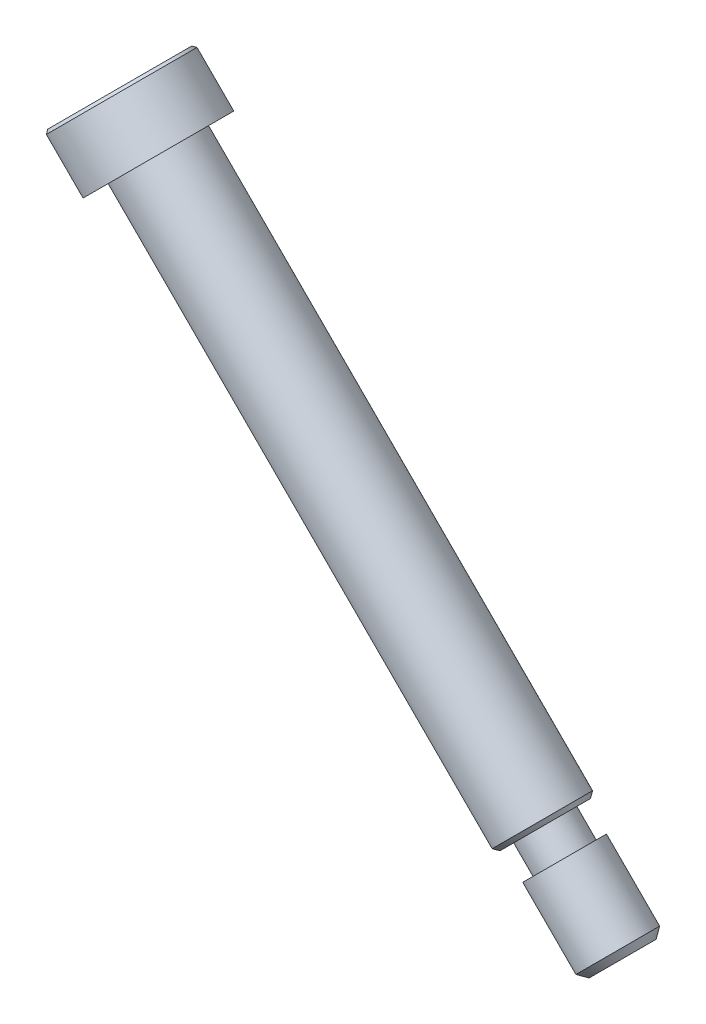
ISO-10303-21;
HEADER;
FILE_DESCRIPTION(('STEP AP214'),'2;1');
FILE_NAME('part.step','',(''),(''),'','','');
FILE_SCHEMA(('AUTOMOTIVE_DESIGN { 1 0 10303 214 1 1 1 1 }'));
ENDSEC;
DATA;
#1=APPLICATION_CONTEXT('core data for automotive mechanical design processes');
#2=APPLICATION_PROTOCOL_DEFINITION('international standard','automotive_design',2000,#1);
#3=PRODUCT_CONTEXT('',#1,'mechanical');
#4=PRODUCT('Part','Part','',(#3));
#5=PRODUCT_RELATED_PRODUCT_CATEGORY('part','',(#4));
#6=PRODUCT_DEFINITION_FORMATION('','',#4);
#7=PRODUCT_DEFINITION_CONTEXT('part definition',#1,'design');
#8=PRODUCT_DEFINITION('design','',#6,#7);
#9=PRODUCT_DEFINITION_SHAPE('','',#8);
#10=(LENGTH_UNIT() NAMED_UNIT(*) SI_UNIT(.MILLI.,.METRE.));
#11=(NAMED_UNIT(*) PLANE_ANGLE_UNIT() SI_UNIT($,.RADIAN.));
#12=(NAMED_UNIT(*) SI_UNIT($,.STERADIAN.) SOLID_ANGLE_UNIT());
#13=UNCERTAINTY_MEASURE_WITH_UNIT(LENGTH_MEASURE(1.E-05),#10,'distance_accuracy_value','');
#14=(GEOMETRIC_REPRESENTATION_CONTEXT(3) GLOBAL_UNCERTAINTY_ASSIGNED_CONTEXT((#13)) GLOBAL_UNIT_ASSIGNED_CONTEXT((#10,
#11,#12)) REPRESENTATION_CONTEXT('',''));
#15=CARTESIAN_POINT('',(0.,0.,0.));
#16=DIRECTION('',(0.,0.,1.));
#17=DIRECTION('',(1.,0.,0.));
#18=AXIS2_PLACEMENT_3D('',#15,#16,#17);
#19=CARTESIAN_POINT('',(-27.1652747662359,27.165274766234,-47.6815));
#20=DIRECTION('',(-0.707106781186548,0.707106781186548,0.));
#21=DIRECTION('',(0.706444278634285,0.706444278634285,0.0432777352661824));
#22=AXIS2_PLACEMENT_3D('',#19,#20,#21);
#23=PLANE('',#22);
#24=CARTESIAN_POINT('',(-27.1652747662359,27.165274766234,-47.6815));
#25=DIRECTION('',(-0.707106781186548,0.707106781186548,0.));
#26=DIRECTION('',(0.706444278634285,0.706444278634285,0.0432777352661824));
#27=AXIS2_PLACEMENT_3D('',#24,#25,#26);
#28=CIRCLE('',#27,7.14375);
#29=CARTESIAN_POINT('',(-22.1186134507422,32.2119360817277,-47.3723346786922));
#30=VERTEX_POINT('',#29);
#31=EDGE_CURVE('E145',#30,#30,#28,.T.);
#32=ORIENTED_EDGE('',*,*,#31,.F.);
#33=EDGE_LOOP('',(#32));
#34=FACE_BOUND('',#33,.T.);
#35=CARTESIAN_POINT('',(-27.1652747662359,27.165274766234,-47.6815));
#36=DIRECTION('',(0.707106781186548,-0.707106781186548,0.));
#37=DIRECTION('',(-0.706444278634285,-0.706444278634285,-0.0432777352661824));
#38=AXIS2_PLACEMENT_3D('',#35,#36,#37);
#39=CIRCLE('',#38,4.7625);
#40=CARTESIAN_POINT('',(-30.5297156432317,23.8008338892382,-47.8876102142052));
#41=VERTEX_POINT('',#40);
#42=EDGE_CURVE('E152',#41,#41,#39,.T.);
#43=ORIENTED_EDGE('',*,*,#42,.F.);
#44=EDGE_LOOP('',(#43));
#45=FACE_BOUND('',#44,.T.);
#46=ADVANCED_FACE('F17',(#34,#45),#23,.F.);
#47=CARTESIAN_POINT('',(17.7360058391099,-17.7360058391118,-47.6815));
#48=DIRECTION('',(0.707106781186548,-0.707106781186548,0.));
#49=DIRECTION('',(-0.706444278634285,-0.706444278634285,-0.0432777352661824));
#50=AXIS2_PLACEMENT_3D('',#47,#48,#49);
#51=PLANE('',#50);
#52=CARTESIAN_POINT('',(17.7360058391099,-17.7360058391118,-47.6815));
#53=DIRECTION('',(0.707106781186548,-0.707106781186548,0.));
#54=DIRECTION('',(0.707106781186548,0.707106781186548,0.));
#55=AXIS2_PLACEMENT_3D('',#52,#53,#54);
#56=CIRCLE('',#55,2.99299355233854);
#57=CARTESIAN_POINT('',(19.8523718760161,-15.6196398022056,-47.6815));
#58=VERTEX_POINT('',#57);
#59=EDGE_CURVE('E319',#58,#58,#56,.T.);
#60=ORIENTED_EDGE('',*,*,#59,.F.);
#61=EDGE_LOOP('',(#60));
#62=FACE_BOUND('',#61,.T.);
#63=CARTESIAN_POINT('',(17.7360058391099,-17.7360058391118,-47.6815));
#64=DIRECTION('',(0.707106781186548,-0.707106781186548,0.));
#65=DIRECTION('',(-0.706444278634285,-0.706444278634285,-0.0432777352661824));
#66=AXIS2_PLACEMENT_3D('',#63,#64,#65);
#67=CIRCLE('',#66,4.29212962962964);
#68=CARTESIAN_POINT('',(14.7038554191013,-20.7681562591204,-47.8672536498392));
#69=VERTEX_POINT('',#68);
#70=EDGE_CURVE('E162',#69,#69,#67,.T.);
#71=ORIENTED_EDGE('',*,*,#70,.T.);
#72=EDGE_LOOP('',(#71));
#73=FACE_BOUND('',#72,.T.);
#74=ADVANCED_FACE('F196',(#62,#73),#51,.T.);
#75=CARTESIAN_POINT('',(-31.6554028267704,31.6554028267686,-47.6815));
#76=DIRECTION('',(0.707106781186548,-0.707106781186548,0.));
#77=DIRECTION('',(-0.706444278634285,-0.706444278634285,-0.0432777352661824));
#78=AXIS2_PLACEMENT_3D('',#75,#76,#77);
#79=CYLINDRICAL_SURFACE('',#78,7.14375);
#80=CARTESIAN_POINT('',(-31.4308964237437,31.4308964237418,-47.6815));
#81=DIRECTION('',(-0.707106781186548,0.707106781186548,0.));
#82=DIRECTION('',(0.706444278634285,0.706444278634285,0.0432777352661824));
#83=AXIS2_PLACEMENT_3D('',#80,#81,#82);
#84=CIRCLE('',#83,7.14375);
#85=CARTESIAN_POINT('',(-26.3842351082501,36.4775577392355,-47.3723346786922));
#86=VERTEX_POINT('',#85);
#87=EDGE_CURVE('E165',#86,#86,#84,.T.);
#88=ORIENTED_EDGE('',*,*,#87,.F.);
#89=EDGE_LOOP('',(#88));
#90=FACE_BOUND('',#89,.T.);
#91=ORIENTED_EDGE('',*,*,#31,.T.);
#92=EDGE_LOOP('',(#91));
#93=FACE_BOUND('',#92,.T.);
#94=ADVANCED_FACE('F201',(#90,#93),#79,.T.);
#95=CARTESIAN_POINT('',(-27.1652747662359,27.165274766234,-47.6815));
#96=DIRECTION('',(0.707106781186548,-0.707106781186548,0.));
#97=DIRECTION('',(-0.706444278634285,-0.706444278634285,-0.0432777352661824));
#98=AXIS2_PLACEMENT_3D('',#95,#96,#97);
#99=CYLINDRICAL_SURFACE('',#98,4.7625);
#100=CARTESIAN_POINT('',(17.4034037605517,-17.4034037605536,-47.6815));
#101=DIRECTION('',(-0.707106781186548,0.707106781186548,0.));
#102=DIRECTION('',(-0.706444278634285,-0.706444278634285,-0.0432777352661824));
#103=AXIS2_PLACEMENT_3D('',#100,#101,#102);
#104=CIRCLE('',#103,4.7625);
#105=CARTESIAN_POINT('',(14.038962883556,-20.7678446375494,-47.8876102142052));
#106=VERTEX_POINT('',#105);
#107=EDGE_CURVE('E159',#106,#106,#104,.T.);
#108=ORIENTED_EDGE('',*,*,#107,.T.);
#109=EDGE_LOOP('',(#108));
#110=FACE_BOUND('',#109,.T.);
#111=ORIENTED_EDGE('',*,*,#42,.T.);
#112=EDGE_LOOP('',(#111));
#113=FACE_BOUND('',#112,.T.);
#114=ADVANCED_FACE('F272',(#110,#113),#99,.T.);
#115=CARTESIAN_POINT('',(17.7360058391099,-17.7360058391118,-47.6815));
#116=DIRECTION('',(-0.707106781186548,0.707106781186548,0.));
#117=DIRECTION('',(0.706444278634285,0.706444278634285,0.0432777352661824));
#118=AXIS2_PLACEMENT_3D('',#115,#116,#117);
#119=CONICAL_SURFACE('',#118,4.29212962962964,0.785398163397438);
#120=ORIENTED_EDGE('',*,*,#107,.F.);
#121=EDGE_LOOP('',(#120));
#122=FACE_BOUND('',#121,.T.);
#123=ORIENTED_EDGE('',*,*,#70,.F.);
#124=EDGE_LOOP('',(#123));
#125=FACE_BOUND('',#124,.T.);
#126=ADVANCED_FACE('F275',(#122,#125),#119,.T.);
#127=CARTESIAN_POINT('',(-30.3086982544381,28.5119793385664,-50.1200178528517));
#128=DIRECTION('',(0.707106781186548,-0.707106781186548,0.));
#129=DIRECTION('',(-0.706444278634285,-0.706444278634285,-0.0432777352661824));
#130=AXIS2_PLACEMENT_3D('',#127,#128,#129);
#131=PLANE('',#130);
#132=DIRECTION('',(-0.379724231473492,-0.379724231473493,0.84357513954818));
#133=VECTOR('',#132,1.);
#134=CARTESIAN_POINT('',(-30.3086982544381,28.5119793385664,-50.1200178528517));
#135=LINE('',#134,#133);
#136=CARTESIAN_POINT('',(-30.3086982544381,28.5119793385664,-50.1200178528517));
#137=VERTEX_POINT('',#136);
#138=CARTESIAN_POINT('',(-31.3527996425093,27.4678779504952,-47.8004977876539));
#139=VERTEX_POINT('',#138);
#140=EDGE_CURVE('E304',#137,#139,#135,.T.);
#141=ORIENTED_EDGE('',*,*,#140,.T.);
#142=DIRECTION('',(0.326720047160793,0.326720047160792,0.886852874814362));
#143=VECTOR('',#142,1.);
#144=CARTESIAN_POINT('',(-31.3527996425093,27.4678779504952,-47.8004977876539));
#145=LINE('',#144,#143);
#146=CARTESIAN_POINT('',(-30.4544401845744,28.3662374084301,-45.3619799348019));
#147=VERTEX_POINT('',#146);
#148=EDGE_CURVE('E308',#139,#147,#145,.T.);
#149=ORIENTED_EDGE('',*,*,#148,.T.);
#150=DIRECTION('',(0.706444278634285,0.706444278634285,0.0432777352661822));
#151=VECTOR('',#150,1.);
#152=CARTESIAN_POINT('',(-30.4544401845744,28.3662374084301,-45.3619799348019));
#153=LINE('',#152,#151);
#154=CARTESIAN_POINT('',(-28.5119793385683,30.3086982544362,-45.2429821471478));
#155=VERTEX_POINT('',#154);
#156=EDGE_CURVE('E91',#147,#155,#153,.T.);
#157=ORIENTED_EDGE('',*,*,#156,.T.);
#158=DIRECTION('',(0.379724231473492,0.379724231473493,-0.84357513954818));
#159=VECTOR('',#158,1.);
#160=CARTESIAN_POINT('',(-28.5119793385683,30.3086982544362,-45.2429821471478));
#161=LINE('',#160,#159);
#162=CARTESIAN_POINT('',(-27.4678779504971,31.3527996425074,-47.5625022123457));
#163=VERTEX_POINT('',#162);
#164=EDGE_CURVE('E333',#155,#163,#161,.T.);
#165=ORIENTED_EDGE('',*,*,#164,.T.);
#166=DIRECTION('',(-0.326720047160793,-0.326720047160792,-0.886852874814362));
#167=VECTOR('',#166,1.);
#168=CARTESIAN_POINT('',(-27.4678779504971,31.3527996425074,-47.5625022123457));
#169=LINE('',#168,#167);
#170=CARTESIAN_POINT('',(-28.3662374084319,30.4544401845725,-50.0010200651976));
#171=VERTEX_POINT('',#170);
#172=EDGE_CURVE('E324',#163,#171,#169,.T.);
#173=ORIENTED_EDGE('',*,*,#172,.T.);
#174=DIRECTION('',(-0.706444278634285,-0.706444278634285,-0.0432777352661824));
#175=VECTOR('',#174,1.);
#176=CARTESIAN_POINT('',(-28.3662374084319,30.4544401845725,-50.0010200651976));
#177=LINE('',#176,#175);
#178=EDGE_CURVE('E313',#171,#137,#177,.T.);
#179=ORIENTED_EDGE('',*,*,#178,.T.);
#180=EDGE_LOOP('',(#141,#149,#157,#165,#173,#179));
#181=FACE_BOUND('',#180,.T.);
#182=ADVANCED_FACE('F212',(#181),#131,.F.);
#183=CARTESIAN_POINT('',(-28.3662374084319,30.4544401845725,-50.0010200651976));
#184=DIRECTION('',(0.0306019800811131,0.0306019800811144,-0.999063079905483));
#185=DIRECTION('',(-0.706444278634285,-0.706444278634285,-0.0432777352661824));
#186=AXIS2_PLACEMENT_3D('',#183,#184,#185);
#187=PLANE('',#186);
#188=DIRECTION('',(-0.707106781186548,0.707106781186548,0.));
#189=VECTOR('',#188,1.);
#190=CARTESIAN_POINT('',(-28.3662374084319,30.4544401845725,-50.0010200651976));
#191=LINE('',#190,#189);
#192=CARTESIAN_POINT('',(-30.6113014386992,32.6995042148398,-50.0010200651976));
#193=VERTEX_POINT('',#192);
#194=EDGE_CURVE('E40',#171,#193,#191,.T.);
#195=ORIENTED_EDGE('',*,*,#194,.T.);
#196=CARTESIAN_POINT('',(-30.6113014386992,32.6995042148398,-50.0010200651976));
#197=CARTESIAN_POINT('',(-30.6446838631461,32.5993599834245,-50.0051100772751));
#198=CARTESIAN_POINT('',(-30.6811434121777,32.500060308167,-50.0092684744385));
#199=CARTESIAN_POINT('',(-30.7620281130701,32.3041180188163,-50.0177478729987));
#200=CARTESIAN_POINT('',(-30.8064984194118,32.2074942473279,-50.0220696803462));
#201=CARTESIAN_POINT('',(-30.9040834446314,32.0205699854004,-50.0307843928736));
#202=CARTESIAN_POINT('',(-30.9570497099695,31.9301934583053,-50.0351750798753));
#203=CARTESIAN_POINT('',(-31.0731510930799,31.7564544416383,-50.0440530880002));
#204=CARTESIAN_POINT('',(-31.1362602828384,31.6730748718948,-50.0485401381081));
#205=CARTESIAN_POINT('',(-31.2533555481128,31.5376900116417,-50.0562737756808));
#206=CARTESIAN_POINT('',(-31.3048349376809,31.4835039877416,-50.0595103789977));
#207=CARTESIAN_POINT('',(-31.4126967828469,31.3802078916413,-50.065978290026));
#208=CARTESIAN_POINT('',(-31.4690809505262,31.3310996050942,-50.069209595484));
#209=CARTESIAN_POINT('',(-31.5861336329909,31.2381636514774,-50.0756416899011));
#210=CARTESIAN_POINT('',(-31.6468068713637,31.1943419549189,-50.0788424406662));
#211=CARTESIAN_POINT('',(-31.7715698213224,31.1119220659865,-50.0851885916114));
#212=CARTESIAN_POINT('',(-31.8356592705749,31.0733234733295,-50.0883339960172));
#213=CARTESIAN_POINT('',(-32.0049710822384,30.9796684825798,-50.096388847619));
#214=CARTESIAN_POINT('',(-32.112227319614,30.9282748318072,-50.1012484013494));
#215=CARTESIAN_POINT('',(-32.2760190433406,30.8587840900938,-50.1083940015665));
#216=CARTESIAN_POINT('',(-32.331023962252,30.8369117738744,-50.1107488034459));
#217=CARTESIAN_POINT('',(-32.4418319927241,30.7953887928188,-50.1154148056977));
#218=CARTESIAN_POINT('',(-32.4976345979643,30.775736783563,-50.1177260317416));
#219=CARTESIAN_POINT('',(-32.5537622847053,30.7570433688337,-50.1200178528517));
#220=B_SPLINE_CURVE_WITH_KNOTS('',3,(#196,#197,#198,#199,#200,#201,#202,#203,#204,#205,#206,
#207,#208,#209,#210,#211,#212,#213,#214,#215,#216,#217,#218,#219),.UNSPECIFIED.,.F.,.F.,(4,2,2,
2,2,2,2,2,2,2,2,4),(0.,0.317141891545325,0.636130795616604,0.950055234477685,1.26318960206751,
1.48730580137507,1.71150054794087,1.93594616870485,2.1603745788786,2.51672581414772,
2.69441806729624,2.8720021426241),.UNSPECIFIED.);
#221=CARTESIAN_POINT('',(-32.5537622847053,30.7570433688337,-50.1200178528517));
#222=VERTEX_POINT('',#221);
#223=EDGE_CURVE('E234',#193,#222,#220,.T.);
#224=ORIENTED_EDGE('',*,*,#223,.T.);
#225=DIRECTION('',(-0.707106781186548,0.707106781186548,0.));
#226=VECTOR('',#225,1.);
#227=CARTESIAN_POINT('',(-30.3086982544381,28.5119793385664,-50.1200178528517));
#228=LINE('',#227,#226);
#229=EDGE_CURVE('E316',#137,#222,#228,.T.);
#230=ORIENTED_EDGE('',*,*,#229,.F.);
#231=ORIENTED_EDGE('',*,*,#178,.F.);
#232=EDGE_LOOP('',(#195,#224,#230,#231));
#233=FACE_BOUND('',#232,.T.);
#234=ADVANCED_FACE('F263',(#233),#187,.F.);
#235=CARTESIAN_POINT('',(-30.3086982544381,28.5119793385664,-50.1200178528517));
#236=DIRECTION('',(-0.596497701614907,-0.596497701614906,-0.537011158111513));
#237=DIRECTION('',(-0.379724231473492,-0.379724231473493,0.84357513954818));
#238=AXIS2_PLACEMENT_3D('',#235,#236,#237);
#239=PLANE('',#238);
#240=ORIENTED_EDGE('',*,*,#229,.T.);
#241=CARTESIAN_POINT('',(-32.5537622847053,30.7570433688337,-50.1200178528517));
#242=CARTESIAN_POINT('',(-32.5562676558446,30.687776190726,-50.0402948154098));
#243=CARTESIAN_POINT('',(-32.5613338866034,30.6198698337412,-49.9592388071455));
#244=CARTESIAN_POINT('',(-32.5782043898847,30.4879417420018,-49.7939572881441));
#245=CARTESIAN_POINT('',(-32.5900477324609,30.423944934279,-49.7097160677147));
#246=CARTESIAN_POINT('',(-32.6218420856305,30.3028113444014,-49.5398477788301));
#247=CARTESIAN_POINT('',(-32.6416613885539,30.245581779721,-49.4542639473892));
#248=CARTESIAN_POINT('',(-32.6907393191795,30.1388662155388,-49.2812126798769));
#249=CARTESIAN_POINT('',(-32.7199740648661,30.0893610898671,-49.1937505264725));
#250=CARTESIAN_POINT('',(-32.7786851652357,30.0123603945187,-49.0430054758249));
#251=CARTESIAN_POINT('',(-32.8057302080935,29.9826087173292,-48.979917190869));
#252=CARTESIAN_POINT('',(-32.8647633383733,29.9281413361152,-48.8538438435735));
#253=CARTESIAN_POINT('',(-32.8967531548898,29.903427400731,-48.7908588251603));
#254=CARTESIAN_POINT('',(-32.9652475156589,29.8590497688096,-48.6654836198232));
#255=CARTESIAN_POINT('',(-33.001757071841,29.839391754442,-48.603094177384));
#256=CARTESIAN_POINT('',(-33.0786105199885,29.8048813673207,-48.4793941931705));
#257=CARTESIAN_POINT('',(-33.1189541177207,29.7900286261838,-48.4180835690323));
#258=CARTESIAN_POINT('',(-33.2274567978754,29.7571827669428,-48.2610773735323));
#259=CARTESIAN_POINT('',(-33.2980264199683,29.742475731453,-48.1663543319694));
#260=CARTESIAN_POINT('',(-33.4078732959445,29.7269298374902,-48.0270713805114));
#261=CARTESIAN_POINT('',(-33.4451009218356,29.7228348142911,-47.9811712817245));
#262=CARTESIAN_POINT('',(-33.5206835305897,29.7165372549535,-47.8902209702891));
#263=CARTESIAN_POINT('',(-33.5590378133278,29.7143335681997,-47.8451702572477));
#264=CARTESIAN_POINT('',(-33.5978636727765,29.7129419807625,-47.8004977876538));
#265=B_SPLINE_CURVE_WITH_KNOTS('',3,(#241,#242,#243,#244,#245,#246,#247,#248,#249,#250,#251,
#252,#253,#254,#255,#256,#257,#258,#259,#260,#261,#262,#263,#264),.UNSPECIFIED.,.F.,.F.,(4,2,2,
2,2,2,2,2,2,2,2,4),(0.,0.317141891545268,0.636130795616565,0.950055234477648,1.26318960206743,
1.48730580137497,1.71150054794078,1.93594616870477,2.16037457887849,2.51672581414762,
2.69441806729616,2.87200214262399),.UNSPECIFIED.);
#266=CARTESIAN_POINT('',(-33.5978636727765,29.7129419807625,-47.8004977876538));
#267=VERTEX_POINT('',#266);
#268=EDGE_CURVE('E225',#222,#267,#265,.T.);
#269=ORIENTED_EDGE('',*,*,#268,.T.);
#270=DIRECTION('',(-0.707106781186548,0.707106781186548,0.));
#271=VECTOR('',#270,1.);
#272=CARTESIAN_POINT('',(-31.3527996425093,27.4678779504952,-47.8004977876539));
#273=LINE('',#272,#271);
#274=EDGE_CURVE('E75',#139,#267,#273,.T.);
#275=ORIENTED_EDGE('',*,*,#274,.F.);
#276=ORIENTED_EDGE('',*,*,#140,.F.);
#277=EDGE_LOOP('',(#240,#269,#275,#276));
#278=FACE_BOUND('',#277,.T.);
#279=ADVANCED_FACE('F266',(#278),#239,.F.);
#280=CARTESIAN_POINT('',(-31.3527996425093,27.4678779504952,-47.8004977876539));
#281=DIRECTION('',(-0.62709968169602,-0.627099681696021,0.46205192179397));
#282=DIRECTION('',(0.326720047160793,0.326720047160792,0.886852874814362));
#283=AXIS2_PLACEMENT_3D('',#280,#281,#282);
#284=PLANE('',#283);
#285=ORIENTED_EDGE('',*,*,#274,.T.);
#286=CARTESIAN_POINT('',(-33.5978636727765,29.7129419807625,-47.8004977876538));
#287=CARTESIAN_POINT('',(-33.5336057159848,29.710438130586,-47.7166847381344));
#288=CARTESIAN_POINT('',(-33.4707923345991,29.7104113857458,-47.6314703327067));
#289=CARTESIAN_POINT('',(-33.3492493427588,29.716896789128,-47.457709415145));
#290=CARTESIAN_POINT('',(-33.2905456464199,29.7234470203202,-47.3691463873682));
#291=CARTESIAN_POINT('',(-33.1800853560161,29.7445680740162,-47.1905633859562));
#292=CARTESIAN_POINT('',(-33.1282332627229,29.7590099055524,-47.1005888675135));
#293=CARTESIAN_POINT('',(-33.0323909934597,29.7972145412588,-46.9186595918764));
#294=CARTESIAN_POINT('',(-32.9883813593951,29.820953795338,-46.8267103883642));
#295=CARTESIAN_POINT('',(-32.9208523970012,29.8701931627533,-46.6682317001439));
#296=CARTESIAN_POINT('',(-32.8950647331249,29.8932741922981,-46.6019068118711));
#297=CARTESIAN_POINT('',(-32.8485188927716,29.9443857817172,-46.4693655535472));
#298=CARTESIAN_POINT('',(-32.8277624821749,29.9724180734462,-46.403149229676));
#299=CARTESIAN_POINT('',(-32.7912625249032,30.0330347595656,-46.2713419299218));
#300=CARTESIAN_POINT('',(-32.7755246136197,30.0656242126636,-46.2057517367176));
#301=CARTESIAN_POINT('',(-32.7487866423216,30.1347052449878,-46.0757056015588));
#302=CARTESIAN_POINT('',(-32.737786219099,30.1711965248056,-46.011249573015));
#303=CARTESIAN_POINT('',(-32.714805498047,30.2698340667711,-45.8461885259131));
#304=CARTESIAN_POINT('',(-32.706050176066,30.3344519753555,-45.7466059306198));
#305=CARTESIAN_POINT('',(-32.6992558193222,30.4355473141128,-45.6001773789447));
#306=CARTESIAN_POINT('',(-32.698044827648,30.469890908479,-45.5519224782784));
#307=CARTESIAN_POINT('',(-32.6974619306381,30.5397588549053,-45.4563061645913));
#308=CARTESIAN_POINT('',(-32.6980889061282,30.5752824753994,-45.4089442255059));
#309=CARTESIAN_POINT('',(-32.6995042148416,30.6113014386974,-45.3619799348019));
#310=B_SPLINE_CURVE_WITH_KNOTS('',3,(#286,#287,#288,#289,#290,#291,#292,#293,#294,#295,#296,
#297,#298,#299,#300,#301,#302,#303,#304,#305,#306,#307,#308,#309),.UNSPECIFIED.,.F.,.F.,(4,2,2,
2,2,2,2,2,2,2,2,4),(0.,0.3171418915452,0.636130795616515,0.950055234477585,1.26318960206732,
1.48730580137483,1.71150054794064,1.93594616870462,2.16037457887833,2.51672581414743,
2.69441806729597,2.87200214262378),.UNSPECIFIED.);
#311=CARTESIAN_POINT('',(-32.6995042148416,30.6113014386974,-45.3619799348019));
#312=VERTEX_POINT('',#311);
#313=EDGE_CURVE('E103',#267,#312,#310,.T.);
#314=ORIENTED_EDGE('',*,*,#313,.T.);
#315=DIRECTION('',(-0.707106781186548,0.707106781186548,0.));
#316=VECTOR('',#315,1.);
#317=CARTESIAN_POINT('',(-30.4544401845744,28.3662374084301,-45.3619799348019));
#318=LINE('',#317,#316);
#319=EDGE_CURVE('E83',#147,#312,#318,.T.);
#320=ORIENTED_EDGE('',*,*,#319,.F.);
#321=ORIENTED_EDGE('',*,*,#148,.F.);
#322=EDGE_LOOP('',(#285,#314,#320,#321));
#323=FACE_BOUND('',#322,.T.);
#324=ADVANCED_FACE('F107',(#323),#284,.F.);
#325=CARTESIAN_POINT('',(-30.4544401845744,28.3662374084301,-45.3619799348019));
#326=DIRECTION('',(-0.030601980081113,-0.0306019800811144,0.999063079905483));
#327=DIRECTION('',(0.706444278634285,0.706444278634285,0.0432777352661822));
#328=AXIS2_PLACEMENT_3D('',#325,#326,#327);
#329=PLANE('',#328);
#330=ORIENTED_EDGE('',*,*,#319,.T.);
#331=CARTESIAN_POINT('',(-32.6995042148416,30.6113014386974,-45.3619799348019));
#332=CARTESIAN_POINT('',(-32.5993599834265,30.6446838631445,-45.3578899227244));
#333=CARTESIAN_POINT('',(-32.500060308169,30.6811434121761,-45.353731525561));
#334=CARTESIAN_POINT('',(-32.3041180188184,30.7620281130687,-45.3452521270008));
#335=CARTESIAN_POINT('',(-32.20749424733,30.8064984194104,-45.3409303196533));
#336=CARTESIAN_POINT('',(-32.0205699854025,30.90408344463,-45.3322156071259));
#337=CARTESIAN_POINT('',(-31.9301934583074,30.9570497099682,-45.3278249201242));
#338=CARTESIAN_POINT('',(-31.7564544416403,31.0731510930784,-45.3189469119992));
#339=CARTESIAN_POINT('',(-31.6730748718965,31.1362602828366,-45.3144598618914));
#340=CARTESIAN_POINT('',(-31.5376900116436,31.2533555481109,-45.3067262243187));
#341=CARTESIAN_POINT('',(-31.4835039877437,31.3048349376793,-45.3034896210018));
#342=CARTESIAN_POINT('',(-31.3802078916437,31.4126967828454,-45.2970217099735));
#343=CARTESIAN_POINT('',(-31.3310996050965,31.4690809505247,-45.2937904045155));
#344=CARTESIAN_POINT('',(-31.2381636514796,31.5861336329893,-45.2873583100983));
#345=CARTESIAN_POINT('',(-31.1943419549213,31.6468068713622,-45.2841575593333));
#346=CARTESIAN_POINT('',(-31.1119220659887,31.7715698213208,-45.277811408388));
#347=CARTESIAN_POINT('',(-31.0733234733315,31.8356592705731,-45.2746660039823));
#348=CARTESIAN_POINT('',(-30.9796684825816,32.0049710822365,-45.2666111523805));
#349=CARTESIAN_POINT('',(-30.9282748318093,32.1122273196122,-45.2617515986501));
#350=CARTESIAN_POINT('',(-30.8587840900961,32.276019043339,-45.254605998433));
#351=CARTESIAN_POINT('',(-30.8369117738767,32.3310239622503,-45.2522511965536));
#352=CARTESIAN_POINT('',(-30.795388792821,32.4418319927224,-45.2475851943019));
#353=CARTESIAN_POINT('',(-30.7757367835651,32.4976345979625,-45.2452739682579));
#354=CARTESIAN_POINT('',(-30.7570433688355,32.5537622847035,-45.2429821471478));
#355=B_SPLINE_CURVE_WITH_KNOTS('',3,(#331,#332,#333,#334,#335,#336,#337,#338,#339,#340,#341,
#342,#343,#344,#345,#346,#347,#348,#349,#350,#351,#352,#353,#354),.UNSPECIFIED.,.F.,.F.,(4,2,2,
2,2,2,2,2,2,2,2,4),(0.,0.317141891545198,0.636130795616546,0.950055234477646,1.26318960206737,
1.48730580137486,1.71150054794065,1.93594616870462,2.16037457887829,2.51672581414741,
2.69441806729596,2.87200214262378),.UNSPECIFIED.);
#356=CARTESIAN_POINT('',(-30.7570433688355,32.5537622847035,-45.2429821471478));
#357=VERTEX_POINT('',#356);
#358=EDGE_CURVE('E87',#312,#357,#355,.T.);
#359=ORIENTED_EDGE('',*,*,#358,.T.);
#360=DIRECTION('',(-0.707106781186548,0.707106781186548,0.));
#361=VECTOR('',#360,1.);
#362=CARTESIAN_POINT('',(-28.5119793385683,30.3086982544362,-45.2429821471478));
#363=LINE('',#362,#361);
#364=EDGE_CURVE('E94',#155,#357,#363,.T.);
#365=ORIENTED_EDGE('',*,*,#364,.F.);
#366=ORIENTED_EDGE('',*,*,#156,.F.);
#367=EDGE_LOOP('',(#330,#359,#365,#366));
#368=FACE_BOUND('',#367,.T.);
#369=ADVANCED_FACE('F85',(#368),#329,.F.);
#370=CARTESIAN_POINT('',(-28.5119793385683,30.3086982544362,-45.2429821471478));
#371=DIRECTION('',(0.596497701614907,0.596497701614906,0.537011158111513));
#372=DIRECTION('',(0.379724231473492,0.379724231473493,-0.84357513954818));
#373=AXIS2_PLACEMENT_3D('',#370,#371,#372);
#374=PLANE('',#373);
#375=ORIENTED_EDGE('',*,*,#364,.T.);
#376=CARTESIAN_POINT('',(-30.7570433688355,32.5537622847035,-45.2429821471478));
#377=CARTESIAN_POINT('',(-30.687776190728,32.556267655843,-45.3227051845898));
#378=CARTESIAN_POINT('',(-30.6198698337433,32.5613338866018,-45.4037611928541));
#379=CARTESIAN_POINT('',(-30.4879417420039,32.5782043898831,-45.5690427118556));
#380=CARTESIAN_POINT('',(-30.423944934281,32.5900477324592,-45.6532839322849));
#381=CARTESIAN_POINT('',(-30.3028113444035,32.6218420856289,-45.8231522211695));
#382=CARTESIAN_POINT('',(-30.2455817797231,32.6416613885523,-45.9087360526104));
#383=CARTESIAN_POINT('',(-30.1388662155408,32.6907393191778,-46.0817873201226));
#384=CARTESIAN_POINT('',(-30.0893610898689,32.7199740648642,-46.169249473527));
#385=CARTESIAN_POINT('',(-30.0123603945206,32.7786851652339,-46.3199945241746));
#386=CARTESIAN_POINT('',(-29.9826087173312,32.8057302080917,-46.3830828091305));
#387=CARTESIAN_POINT('',(-29.9281413361173,32.8647633383715,-46.509156156426));
#388=CARTESIAN_POINT('',(-29.903427400733,32.896753154888,-46.5721411748392));
#389=CARTESIAN_POINT('',(-29.8590497688116,32.9652475156571,-46.6975163801763));
#390=CARTESIAN_POINT('',(-29.839391754444,33.0017570718392,-46.7599058226155));
#391=CARTESIAN_POINT('',(-29.8048813673226,33.0786105199866,-46.883605806829));
#392=CARTESIAN_POINT('',(-29.7900286261857,33.1189541177188,-46.9449164309672));
#393=CARTESIAN_POINT('',(-29.7571827669446,33.2274567978735,-47.1019226264672));
#394=CARTESIAN_POINT('',(-29.7424757314549,33.2980264199665,-47.1966456680301));
#395=CARTESIAN_POINT('',(-29.7269298374921,33.4078732959426,-47.3359286194882));
#396=CARTESIAN_POINT('',(-29.722834814293,33.4451009218337,-47.3818287182751));
#397=CARTESIAN_POINT('',(-29.7165372549554,33.5206835305878,-47.4727790297104));
#398=CARTESIAN_POINT('',(-29.7143335682016,33.5590378133259,-47.5178297427518));
#399=CARTESIAN_POINT('',(-29.7129419807644,33.5978636727747,-47.5625022123457));
#400=B_SPLINE_CURVE_WITH_KNOTS('',3,(#376,#377,#378,#379,#380,#381,#382,#383,#384,#385,#386,
#387,#388,#389,#390,#391,#392,#393,#394,#395,#396,#397,#398,#399),.UNSPECIFIED.,.F.,.F.,(4,2,2,
2,2,2,2,2,2,2,2,4),(0.,0.317141891545202,0.636130795616523,0.950055234477601,1.26318960206733,
1.48730580137484,1.71150054794065,1.93594616870463,2.16037457887833,2.51672581414747,
2.69441806729602,2.87200214262387),.UNSPECIFIED.);
#401=CARTESIAN_POINT('',(-29.7129419807644,33.5978636727747,-47.5625022123457));
#402=VERTEX_POINT('',#401);
#403=EDGE_CURVE('E102',#357,#402,#400,.T.);
#404=ORIENTED_EDGE('',*,*,#403,.T.);
#405=DIRECTION('',(-0.707106781186548,0.707106781186548,0.));
#406=VECTOR('',#405,1.);
#407=CARTESIAN_POINT('',(-27.4678779504971,31.3527996425074,-47.5625022123457));
#408=LINE('',#407,#406);
#409=EDGE_CURVE('E328',#163,#402,#408,.T.);
#410=ORIENTED_EDGE('',*,*,#409,.F.);
#411=ORIENTED_EDGE('',*,*,#164,.F.);
#412=EDGE_LOOP('',(#375,#404,#410,#411));
#413=FACE_BOUND('',#412,.T.);
#414=ADVANCED_FACE('F254',(#413),#374,.F.);
#415=CARTESIAN_POINT('',(-27.4678779504971,31.3527996425074,-47.5625022123457));
#416=DIRECTION('',(0.62709968169602,0.627099681696021,-0.46205192179397));
#417=DIRECTION('',(-0.326720047160793,-0.326720047160792,-0.886852874814362));
#418=AXIS2_PLACEMENT_3D('',#415,#416,#417);
#419=PLANE('',#418);
#420=ORIENTED_EDGE('',*,*,#409,.T.);
#421=CARTESIAN_POINT('',(-29.7129419807644,33.5978636727747,-47.5625022123457));
#422=CARTESIAN_POINT('',(-29.7104381305879,33.5336057159829,-47.6463152618651));
#423=CARTESIAN_POINT('',(-29.7104113857477,33.4707923345972,-47.7315296672929));
#424=CARTESIAN_POINT('',(-29.7168967891298,33.3492493427569,-47.9052905848545));
#425=CARTESIAN_POINT('',(-29.723447020322,33.290545646418,-47.9938536126313));
#426=CARTESIAN_POINT('',(-29.7445680740179,33.1800853560141,-48.1724366140433));
#427=CARTESIAN_POINT('',(-29.7590099055542,33.1282332627209,-48.262411132486));
#428=CARTESIAN_POINT('',(-29.7972145412606,33.0323909934578,-48.4443404081231));
#429=CARTESIAN_POINT('',(-29.8209537953399,32.9883813593933,-48.5362896116353));
#430=CARTESIAN_POINT('',(-29.8701931627552,32.9208523969993,-48.6947682998556));
#431=CARTESIAN_POINT('',(-29.8932741922998,32.8950647331229,-48.7610931881284));
#432=CARTESIAN_POINT('',(-29.9443857817189,32.8485188927696,-48.8936344464523));
#433=CARTESIAN_POINT('',(-29.9724180734478,32.8277624821728,-48.9598507703235));
#434=CARTESIAN_POINT('',(-30.0330347595673,32.7912625249012,-49.0916580700778));
#435=CARTESIAN_POINT('',(-30.0656242126652,32.7755246136176,-49.157248263282));
#436=CARTESIAN_POINT('',(-30.1347052449895,32.7487866423196,-49.2872943984408));
#437=CARTESIAN_POINT('',(-30.1711965248074,32.7377862190971,-49.3517504269845));
#438=CARTESIAN_POINT('',(-30.269834066773,32.7148054980452,-49.5168114740864));
#439=CARTESIAN_POINT('',(-30.3344519753572,32.706050176064,-49.6163940693798));
#440=CARTESIAN_POINT('',(-30.4355473141144,32.69925581932,-49.762822621055));
#441=CARTESIAN_POINT('',(-30.4698909084806,32.6980448276458,-49.8110775217212));
#442=CARTESIAN_POINT('',(-30.5397588549069,32.697461930636,-49.9066938354083));
#443=CARTESIAN_POINT('',(-30.5752824754012,32.6980889061262,-49.9540557744937));
#444=CARTESIAN_POINT('',(-30.6113014386992,32.6995042148398,-50.0010200651976));
#445=B_SPLINE_CURVE_WITH_KNOTS('',3,(#421,#422,#423,#424,#425,#426,#427,#428,#429,#430,#431,
#432,#433,#434,#435,#436,#437,#438,#439,#440,#441,#442,#443,#444),.UNSPECIFIED.,.F.,.F.,(4,2,2,
2,2,2,2,2,2,2,2,4),(0.,0.317141891545258,0.636130795616544,0.950055234477604,1.26318960206738,
1.48730580137492,1.71150054794072,1.9359461687047,2.16037457887843,2.51672581414754,
2.69441806729606,2.87200214262391),.UNSPECIFIED.);
#446=EDGE_CURVE('E241',#402,#193,#445,.T.);
#447=ORIENTED_EDGE('',*,*,#446,.T.);
#448=ORIENTED_EDGE('',*,*,#194,.F.);
#449=ORIENTED_EDGE('',*,*,#172,.F.);
#450=EDGE_LOOP('',(#420,#447,#448,#449));
#451=FACE_BOUND('',#450,.T.);
#452=ADVANCED_FACE('F257',(#451),#419,.F.);
#453=CARTESIAN_POINT('',(-31.6554028267704,31.6554028267686,-47.6815));
#454=DIRECTION('',(-0.707106781186548,0.707106781186548,0.));
#455=DIRECTION('',(0.706444278634285,0.706444278634285,0.0432777352661824));
#456=AXIS2_PLACEMENT_3D('',#453,#454,#455);
#457=CONICAL_SURFACE('',#456,2.7496306570156,0.78539816339745);
#458=CARTESIAN_POINT('',(-31.6554028267704,31.6554028267686,-47.6815));
#459=DIRECTION('',(-0.707106781186548,0.707106781186548,0.));
#460=DIRECTION('',(0.706444278634285,0.706444278634285,0.0432777352661824));
#461=AXIS2_PLACEMENT_3D('',#458,#459,#460);
#462=CIRCLE('',#461,2.7496306570156);
#463=EDGE_CURVE('E111',#193,#222,#462,.T.);
#464=ORIENTED_EDGE('',*,*,#463,.T.);
#465=ORIENTED_EDGE('',*,*,#223,.F.);
#466=EDGE_LOOP('',(#464,#465));
#467=FACE_BOUND('',#466,.T.);
#468=ADVANCED_FACE('F262',(#467),#457,.F.);
#469=EDGE_CURVE('E119',#222,#267,#462,.T.);
#470=ORIENTED_EDGE('',*,*,#469,.T.);
#471=ORIENTED_EDGE('',*,*,#268,.F.);
#472=EDGE_LOOP('',(#470,#471));
#473=FACE_BOUND('',#472,.T.);
#474=ADVANCED_FACE('F211',(#473),#457,.F.);
#475=EDGE_CURVE('E114',#267,#312,#462,.T.);
#476=ORIENTED_EDGE('',*,*,#475,.T.);
#477=ORIENTED_EDGE('',*,*,#313,.F.);
#478=EDGE_LOOP('',(#476,#477));
#479=FACE_BOUND('',#478,.T.);
#480=ADVANCED_FACE('F115',(#479),#457,.F.);
#481=EDGE_CURVE('E99',#312,#357,#462,.T.);
#482=ORIENTED_EDGE('',*,*,#481,.T.);
#483=ORIENTED_EDGE('',*,*,#358,.F.);
#484=EDGE_LOOP('',(#482,#483));
#485=FACE_BOUND('',#484,.T.);
#486=ADVANCED_FACE('F97',(#485),#457,.F.);
#487=EDGE_CURVE('E125',#357,#402,#462,.T.);
#488=ORIENTED_EDGE('',*,*,#487,.T.);
#489=ORIENTED_EDGE('',*,*,#403,.F.);
#490=EDGE_LOOP('',(#488,#489));
#491=FACE_BOUND('',#490,.T.);
#492=ADVANCED_FACE('F210',(#491),#457,.F.);
#493=EDGE_CURVE('E132',#402,#193,#462,.T.);
#494=ORIENTED_EDGE('',*,*,#493,.T.);
#495=ORIENTED_EDGE('',*,*,#446,.F.);
#496=EDGE_LOOP('',(#494,#495));
#497=FACE_BOUND('',#496,.T.);
#498=ADVANCED_FACE('F288',(#497),#457,.F.);
#499=CARTESIAN_POINT('',(-31.6554028267704,31.6554028267686,-47.6815));
#500=DIRECTION('',(-0.707106781186548,0.707106781186548,0.));
#501=DIRECTION('',(0.706444278634285,0.706444278634285,0.0432777352661824));
#502=AXIS2_PLACEMENT_3D('',#499,#500,#501);
#503=PLANE('',#502);
#504=ORIENTED_EDGE('',*,*,#493,.F.);
#505=ORIENTED_EDGE('',*,*,#487,.F.);
#506=ORIENTED_EDGE('',*,*,#481,.F.);
#507=ORIENTED_EDGE('',*,*,#475,.F.);
#508=ORIENTED_EDGE('',*,*,#469,.F.);
#509=ORIENTED_EDGE('',*,*,#463,.F.);
#510=EDGE_LOOP('',(#504,#505,#506,#507,#508,#509));
#511=FACE_BOUND('',#510,.T.);
#512=CARTESIAN_POINT('',(-31.6554028267704,31.6554028267686,-47.6815));
#513=DIRECTION('',(-0.707106781186548,0.707106781186548,0.));
#514=DIRECTION('',(0.706444278634285,0.706444278634285,0.0432777352661824));
#515=AXIS2_PLACEMENT_3D('',#512,#513,#514);
#516=CIRCLE('',#515,6.82625);
#517=CARTESIAN_POINT('',(-26.8330375697432,36.4777680837959,-47.3860753596392));
#518=VERTEX_POINT('',#517);
#519=EDGE_CURVE('E173',#518,#518,#516,.T.);
#520=ORIENTED_EDGE('',*,*,#519,.T.);
#521=EDGE_LOOP('',(#520));
#522=FACE_BOUND('',#521,.T.);
#523=ADVANCED_FACE('F122',(#511,#522),#503,.T.);
#524=CARTESIAN_POINT('',(-31.6554028267704,31.6554028267686,-47.6815));
#525=DIRECTION('',(0.707106781186548,-0.707106781186548,0.));
#526=DIRECTION('',(-0.706444278634285,-0.706444278634285,-0.0432777352661824));
#527=AXIS2_PLACEMENT_3D('',#524,#525,#526);
#528=CONICAL_SURFACE('',#527,6.82625,0.785398163397457);
#529=ORIENTED_EDGE('',*,*,#87,.T.);
#530=EDGE_LOOP('',(#529));
#531=FACE_BOUND('',#530,.T.);
#532=ORIENTED_EDGE('',*,*,#519,.F.);
#533=EDGE_LOOP('',(#532));
#534=FACE_BOUND('',#533,.T.);
#535=ADVANCED_FACE('F279',(#531,#534),#528,.T.);
#536=CARTESIAN_POINT('',(26.7162619601791,-26.716261960181,-47.6815));
#537=DIRECTION('',(0.707106781186548,-0.707106781186548,0.));
#538=DIRECTION('',(-0.706444278634285,-0.706444278634285,-0.0432777352661824));
#539=AXIS2_PLACEMENT_3D('',#536,#537,#538);
#540=PLANE('',#539);
#541=CARTESIAN_POINT('',(26.7162619601791,-26.716261960181,-47.6815));
#542=DIRECTION('',(0.707106781186548,-0.707106781186548,0.));
#543=DIRECTION('',(0.707106781186548,0.707106781186548,0.));
#544=AXIS2_PLACEMENT_3D('',#541,#542,#543);
#545=CIRCLE('',#544,3.175);
#546=CARTESIAN_POINT('',(28.9613259904463,-24.4711979299137,-47.6815));
#547=VERTEX_POINT('',#546);
#548=EDGE_CURVE('E28',#547,#547,#545,.T.);
#549=ORIENTED_EDGE('',*,*,#548,.T.);
#550=EDGE_LOOP('',(#549));
#551=FACE_BOUND('',#550,.T.);
#552=ADVANCED_FACE('F192',(#551),#540,.T.);
#553=CARTESIAN_POINT('',(26.7162619601791,-26.716261960181,-47.6815));
#554=DIRECTION('',(-0.707106781186548,0.707106781186548,0.));
#555=DIRECTION('',(0.706444278634285,0.706444278634285,0.0432777352661824));
#556=AXIS2_PLACEMENT_3D('',#553,#554,#555);
#557=CYLINDRICAL_SURFACE('',#556,3.96875);
#558=CARTESIAN_POINT('',(26.1549959526122,-26.1549959526141,-47.6815));
#559=DIRECTION('',(0.707106781186548,-0.707106781186548,0.));
#560=DIRECTION('',(0.707106781186548,0.707106781186548,0.));
#561=AXIS2_PLACEMENT_3D('',#558,#559,#560);
#562=CIRCLE('',#561,3.96875);
#563=CARTESIAN_POINT('',(28.9613259904464,-23.34866591478,-47.6815));
#564=VERTEX_POINT('',#563);
#565=EDGE_CURVE('E11',#564,#564,#562,.F.);
#566=ORIENTED_EDGE('',*,*,#565,.T.);
#567=EDGE_LOOP('',(#566));
#568=FACE_BOUND('',#567,.T.);
#569=CARTESIAN_POINT('',(19.9810698693772,-19.981069869379,-47.6815));
#570=DIRECTION('',(-0.707106781186548,0.707106781186548,0.));
#571=DIRECTION('',(-0.707106781186548,-0.707106781186548,0.));
#572=AXIS2_PLACEMENT_3D('',#569,#570,#571);
#573=CIRCLE('',#572,3.96875);
#574=CARTESIAN_POINT('',(17.1747398315431,-22.7873999072132,-47.6815));
#575=VERTEX_POINT('',#574);
#576=EDGE_CURVE('E174',#575,#575,#573,.F.);
#577=ORIENTED_EDGE('',*,*,#576,.T.);
#578=EDGE_LOOP('',(#577));
#579=FACE_BOUND('',#578,.T.);
#580=ADVANCED_FACE('F180',(#568,#579),#557,.T.);
#581=CARTESIAN_POINT('',(19.9810698693772,-19.981069869379,-47.6815));
#582=DIRECTION('',(-0.707106781186548,0.707106781186548,0.));
#583=DIRECTION('',(-0.707106781186548,-0.707106781186548,0.));
#584=AXIS2_PLACEMENT_3D('',#581,#582,#583);
#585=PLANE('',#584);
#586=CARTESIAN_POINT('',(19.9810698693772,-19.981069869379,-47.6815));
#587=DIRECTION('',(-0.707106781186548,0.707106781186548,0.));
#588=DIRECTION('',(-0.707106781186548,-0.707106781186548,0.));
#589=AXIS2_PLACEMENT_3D('',#586,#587,#588);
#590=CIRCLE('',#589,2.99299355233854);
#591=CARTESIAN_POINT('',(17.864703832471,-22.0974359062852,-47.6815));
#592=VERTEX_POINT('',#591);
#593=EDGE_CURVE('E169',#592,#592,#590,.F.);
#594=ORIENTED_EDGE('',*,*,#593,.T.);
#595=EDGE_LOOP('',(#594));
#596=FACE_BOUND('',#595,.T.);
#597=ORIENTED_EDGE('',*,*,#576,.F.);
#598=EDGE_LOOP('',(#597));
#599=FACE_BOUND('',#598,.T.);
#600=ADVANCED_FACE('F182',(#596,#599),#585,.T.);
#601=CARTESIAN_POINT('',(-27.1652747662359,27.165274766234,-47.6815));
#602=DIRECTION('',(-0.707106781186548,0.707106781186548,0.));
#603=DIRECTION('',(-0.030601980081113,-0.0306019800811145,0.999063079905483));
#604=AXIS2_PLACEMENT_3D('',#601,#602,#603);
#605=CYLINDRICAL_SURFACE('',#604,2.99299355233854);
#606=ORIENTED_EDGE('',*,*,#593,.F.);
#607=EDGE_LOOP('',(#606));
#608=FACE_BOUND('',#607,.T.);
#609=ORIENTED_EDGE('',*,*,#59,.T.);
#610=EDGE_LOOP('',(#609));
#611=FACE_BOUND('',#610,.T.);
#612=ADVANCED_FACE('F184',(#608,#611),#605,.T.);
#613=CARTESIAN_POINT('',(26.7162619601791,-26.716261960181,-47.6815));
#614=DIRECTION('',(-0.707106781186548,0.707106781186548,0.));
#615=DIRECTION('',(-0.707106781186548,-0.707106781186548,0.));
#616=AXIS2_PLACEMENT_3D('',#613,#614,#615);
#617=CONICAL_SURFACE('',#616,3.175,0.785398163397449);
#618=ORIENTED_EDGE('',*,*,#565,.F.);
#619=EDGE_LOOP('',(#618));
#620=FACE_BOUND('',#619,.T.);
#621=ORIENTED_EDGE('',*,*,#548,.F.);
#622=EDGE_LOOP('',(#621));
#623=FACE_BOUND('',#622,.T.);
#624=ADVANCED_FACE('F20',(#620,#623),#617,.T.);
#625=CLOSED_SHELL('',(#46,#74,#94,#114,#126,#182,#234,#279,#324,#369,#414,#452,#468,#474,#480,
#486,#492,#498,#523,#535,#552,#580,#600,#612,#624));
#626=MANIFOLD_SOLID_BREP('B1',#625);
#627=ADVANCED_BREP_SHAPE_REPRESENTATION('',(#18,#626),#14);
#628=SHAPE_DEFINITION_REPRESENTATION(#9,#627);
ENDSEC;
END-ISO-10303-21;
